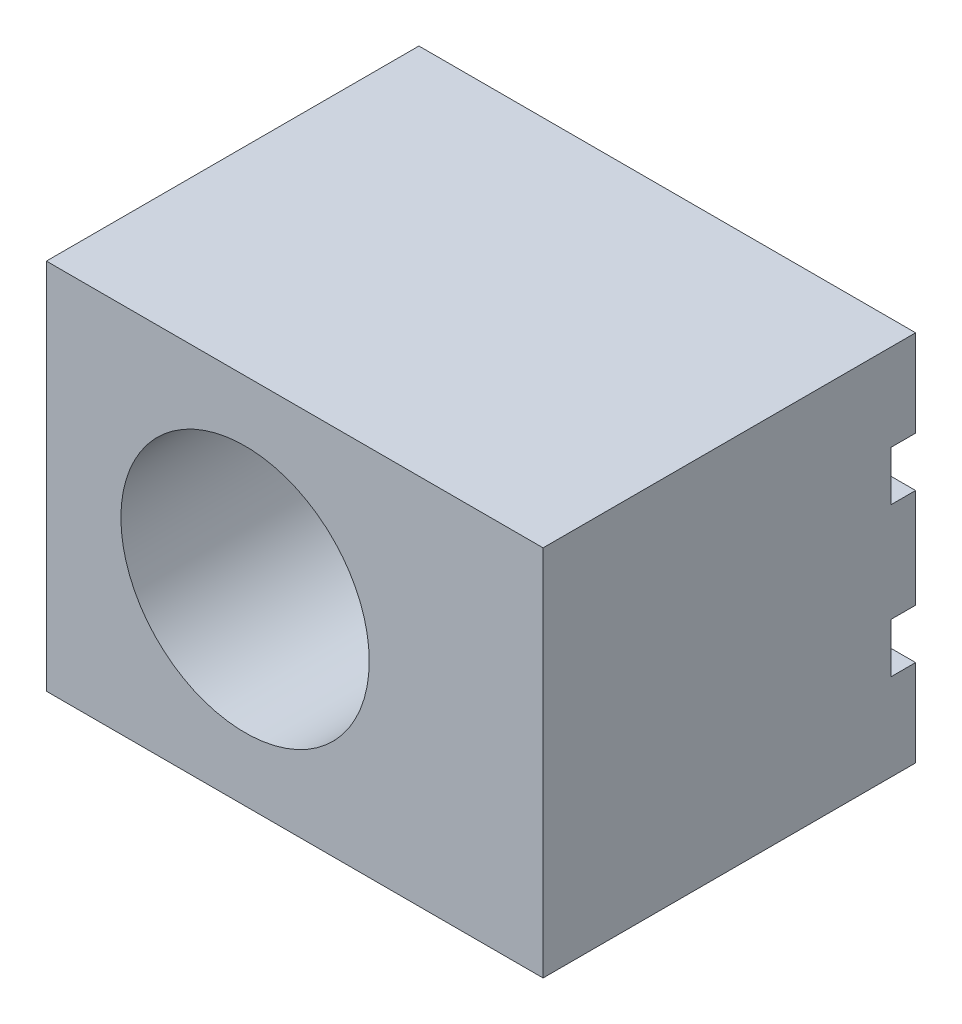
ISO-10303-21;
HEADER;
FILE_DESCRIPTION(('STEP AP214'),'2;1');
FILE_NAME('part.step','',(''),(''),'','','');
FILE_SCHEMA(('AUTOMOTIVE_DESIGN { 1 0 10303 214 1 1 1 1 }'));
ENDSEC;
DATA;
#1=APPLICATION_CONTEXT('core data for automotive mechanical design processes');
#2=APPLICATION_PROTOCOL_DEFINITION('international standard','automotive_design',2000,#1);
#3=PRODUCT_CONTEXT('',#1,'mechanical');
#4=PRODUCT('Part','Part','',(#3));
#5=PRODUCT_RELATED_PRODUCT_CATEGORY('part','',(#4));
#6=PRODUCT_DEFINITION_FORMATION('','',#4);
#7=PRODUCT_DEFINITION_CONTEXT('part definition',#1,'design');
#8=PRODUCT_DEFINITION('design','',#6,#7);
#9=PRODUCT_DEFINITION_SHAPE('','',#8);
#10=(LENGTH_UNIT() NAMED_UNIT(*) SI_UNIT(.MILLI.,.METRE.));
#11=(NAMED_UNIT(*) PLANE_ANGLE_UNIT() SI_UNIT($,.RADIAN.));
#12=(NAMED_UNIT(*) SI_UNIT($,.STERADIAN.) SOLID_ANGLE_UNIT());
#13=UNCERTAINTY_MEASURE_WITH_UNIT(LENGTH_MEASURE(1.E-05),#10,'distance_accuracy_value','');
#14=(GEOMETRIC_REPRESENTATION_CONTEXT(3) GLOBAL_UNCERTAINTY_ASSIGNED_CONTEXT((#13)) GLOBAL_UNIT_ASSIGNED_CONTEXT((#10,
#11,#12)) REPRESENTATION_CONTEXT('',''));
#15=CARTESIAN_POINT('',(0.,0.,0.));
#16=DIRECTION('',(0.,0.,1.));
#17=DIRECTION('',(1.,0.,0.));
#18=AXIS2_PLACEMENT_3D('',#15,#16,#17);
#19=CARTESIAN_POINT('',(0.,0.,0.));
#20=DIRECTION('',(0.,0.,1.));
#21=DIRECTION('',(1.,0.,0.));
#22=AXIS2_PLACEMENT_3D('',#19,#20,#21);
#23=PLANE('',#22);
#24=DIRECTION('',(0.,-1.,0.));
#25=VECTOR('',#24,1.);
#26=CARTESIAN_POINT('',(-4.70744680851064,-3.77659574468085,0.));
#27=LINE('',#26,#25);
#28=CARTESIAN_POINT('',(-4.70744680851064,-2.02659574468085,0.));
#29=VERTEX_POINT('',#28);
#30=CARTESIAN_POINT('',(-4.70744680851064,-3.77659574468085,0.));
#31=VERTEX_POINT('',#30);
#32=EDGE_CURVE('E294',#29,#31,#27,.T.);
#33=ORIENTED_EDGE('',*,*,#32,.F.);
#34=DIRECTION('',(-1.,0.,0.));
#35=VECTOR('',#34,1.);
#36=CARTESIAN_POINT('',(-4.70744680851064,-2.02659574468085,0.));
#37=LINE('',#36,#35);
#38=CARTESIAN_POINT('',(-2.17131486528402,-2.02659574468085,0.));
#39=VERTEX_POINT('',#38);
#40=EDGE_CURVE('E427',#39,#29,#37,.T.);
#41=ORIENTED_EDGE('',*,*,#40,.F.);
#42=CARTESIAN_POINT('',(-0.707446808510637,0.,0.));
#43=DIRECTION('',(0.,0.,1.));
#44=DIRECTION('',(1.,0.,0.));
#45=AXIS2_PLACEMENT_3D('',#42,#43,#44);
#46=CIRCLE('',#45,2.5);
#47=CARTESIAN_POINT('',(0.756421248262748,-2.02659574468085,0.));
#48=VERTEX_POINT('',#47);
#49=EDGE_CURVE('E259',#39,#48,#46,.T.);
#50=ORIENTED_EDGE('',*,*,#49,.T.);
#51=CARTESIAN_POINT('',(5.29255319148936,-2.02659574468085,0.));
#52=VERTEX_POINT('',#51);
#53=EDGE_CURVE('E200',#52,#48,#37,.T.);
#54=ORIENTED_EDGE('',*,*,#53,.F.);
#55=DIRECTION('',(0.,1.,0.));
#56=VECTOR('',#55,1.);
#57=CARTESIAN_POINT('',(5.29255319148936,-3.77659574468085,0.));
#58=LINE('',#57,#56);
#59=CARTESIAN_POINT('',(5.29255319148936,-3.77659574468085,0.));
#60=VERTEX_POINT('',#59);
#61=EDGE_CURVE('E286',#60,#52,#58,.T.);
#62=ORIENTED_EDGE('',*,*,#61,.F.);
#63=DIRECTION('',(1.,0.,0.));
#64=VECTOR('',#63,1.);
#65=CARTESIAN_POINT('',(-4.70744680851064,-3.77659574468085,0.));
#66=LINE('',#65,#64);
#67=EDGE_CURVE('E281',#31,#60,#66,.T.);
#68=ORIENTED_EDGE('',*,*,#67,.F.);
#69=EDGE_LOOP('',(#33,#41,#50,#54,#62,#68));
#70=FACE_BOUND('',#69,.T.);
#71=ADVANCED_FACE('F45',(#70),#23,.F.);
#72=CARTESIAN_POINT('',(5.29255319148936,-1.02659574468085,0.));
#73=VERTEX_POINT('',#72);
#74=CARTESIAN_POINT('',(5.29255319148936,0.973404255319154,0.));
#75=VERTEX_POINT('',#74);
#76=EDGE_CURVE('E291',#73,#75,#58,.T.);
#77=ORIENTED_EDGE('',*,*,#76,.F.);
#78=DIRECTION('',(1.,0.,0.));
#79=VECTOR('',#78,1.);
#80=CARTESIAN_POINT('',(-4.70744680851064,-1.02659574468085,0.));
#81=LINE('',#80,#79);
#82=CARTESIAN_POINT('',(1.57204900789333,-1.02659574468085,0.));
#83=VERTEX_POINT('',#82);
#84=EDGE_CURVE('E240',#83,#73,#81,.T.);
#85=ORIENTED_EDGE('',*,*,#84,.F.);
#86=CARTESIAN_POINT('',(1.5952655390757,0.973404255319154,0.));
#87=VERTEX_POINT('',#86);
#88=EDGE_CURVE('E255',#83,#87,#46,.T.);
#89=ORIENTED_EDGE('',*,*,#88,.T.);
#90=DIRECTION('',(-1.,0.,0.));
#91=VECTOR('',#90,1.);
#92=CARTESIAN_POINT('',(-4.70744680851064,0.973404255319154,0.));
#93=LINE('',#92,#91);
#94=EDGE_CURVE('E232',#75,#87,#93,.T.);
#95=ORIENTED_EDGE('',*,*,#94,.F.);
#96=EDGE_LOOP('',(#77,#85,#89,#95));
#97=FACE_BOUND('',#96,.T.);
#98=ADVANCED_FACE('F402',(#97),#23,.F.);
#99=CARTESIAN_POINT('',(-3.01015915609697,0.973404255319154,0.));
#100=VERTEX_POINT('',#99);
#101=CARTESIAN_POINT('',(-2.9869426249146,-1.02659574468085,0.));
#102=VERTEX_POINT('',#101);
#103=EDGE_CURVE('E361',#100,#102,#46,.T.);
#104=ORIENTED_EDGE('',*,*,#103,.T.);
#105=CARTESIAN_POINT('',(-4.70744680851064,-1.02659574468085,0.));
#106=VERTEX_POINT('',#105);
#107=EDGE_CURVE('E428',#106,#102,#81,.T.);
#108=ORIENTED_EDGE('',*,*,#107,.F.);
#109=CARTESIAN_POINT('',(-4.70744680851064,0.973404255319154,0.));
#110=VERTEX_POINT('',#109);
#111=EDGE_CURVE('E206',#110,#106,#27,.T.);
#112=ORIENTED_EDGE('',*,*,#111,.F.);
#113=EDGE_CURVE('E236',#100,#110,#93,.T.);
#114=ORIENTED_EDGE('',*,*,#113,.F.);
#115=EDGE_LOOP('',(#104,#108,#112,#114));
#116=FACE_BOUND('',#115,.T.);
#117=ADVANCED_FACE('F450',(#116),#23,.F.);
#118=CARTESIAN_POINT('',(-4.70744680851064,-3.77659574468085,7.5));
#119=DIRECTION('',(0.,1.,0.));
#120=DIRECTION('',(0.,0.,1.));
#121=AXIS2_PLACEMENT_3D('',#118,#119,#120);
#122=PLANE('',#121);
#123=ORIENTED_EDGE('',*,*,#67,.T.);
#124=DIRECTION('',(0.,0.,-1.));
#125=VECTOR('',#124,1.);
#126=CARTESIAN_POINT('',(5.29255319148936,-3.77659574468085,7.5));
#127=LINE('',#126,#125);
#128=CARTESIAN_POINT('',(5.29255319148936,-3.77659574468085,7.5));
#129=VERTEX_POINT('',#128);
#130=EDGE_CURVE('E309',#129,#60,#127,.T.);
#131=ORIENTED_EDGE('',*,*,#130,.F.);
#132=DIRECTION('',(1.,0.,0.));
#133=VECTOR('',#132,1.);
#134=CARTESIAN_POINT('',(-4.70744680851064,-3.77659574468085,7.5));
#135=LINE('',#134,#133);
#136=CARTESIAN_POINT('',(-4.70744680851064,-3.77659574468085,7.5));
#137=VERTEX_POINT('',#136);
#138=EDGE_CURVE('E266',#137,#129,#135,.T.);
#139=ORIENTED_EDGE('',*,*,#138,.F.);
#140=DIRECTION('',(0.,0.,-1.));
#141=VECTOR('',#140,1.);
#142=CARTESIAN_POINT('',(-4.70744680851064,-3.77659574468085,7.5));
#143=LINE('',#142,#141);
#144=EDGE_CURVE('E280',#137,#31,#143,.T.);
#145=ORIENTED_EDGE('',*,*,#144,.T.);
#146=EDGE_LOOP('',(#123,#131,#139,#145));
#147=FACE_BOUND('',#146,.T.);
#148=ADVANCED_FACE('F47',(#147),#122,.F.);
#149=CARTESIAN_POINT('',(5.29255319148936,-3.77659574468085,7.5));
#150=DIRECTION('',(-1.,0.,0.));
#151=DIRECTION('',(0.,0.,1.));
#152=AXIS2_PLACEMENT_3D('',#149,#150,#151);
#153=PLANE('',#152);
#154=ORIENTED_EDGE('',*,*,#61,.T.);
#155=DIRECTION('',(0.,0.,-1.));
#156=VECTOR('',#155,1.);
#157=CARTESIAN_POINT('',(5.29255319148936,-2.02659574468085,0.5));
#158=LINE('',#157,#156);
#159=CARTESIAN_POINT('',(5.29255319148936,-2.02659574468085,0.5));
#160=VERTEX_POINT('',#159);
#161=EDGE_CURVE('E213',#160,#52,#158,.T.);
#162=ORIENTED_EDGE('',*,*,#161,.F.);
#163=DIRECTION('',(0.,-1.,0.));
#164=VECTOR('',#163,1.);
#165=CARTESIAN_POINT('',(5.29255319148936,-2.02659574468085,0.5));
#166=LINE('',#165,#164);
#167=CARTESIAN_POINT('',(5.29255319148936,-1.02659574468085,0.5));
#168=VERTEX_POINT('',#167);
#169=EDGE_CURVE('E188',#168,#160,#166,.T.);
#170=ORIENTED_EDGE('',*,*,#169,.F.);
#171=DIRECTION('',(0.,0.,-1.));
#172=VECTOR('',#171,1.);
#173=CARTESIAN_POINT('',(5.29255319148936,-1.02659574468085,0.5));
#174=LINE('',#173,#172);
#175=EDGE_CURVE('E208',#168,#73,#174,.T.);
#176=ORIENTED_EDGE('',*,*,#175,.T.);
#177=ORIENTED_EDGE('',*,*,#76,.T.);
#178=DIRECTION('',(0.,0.,-1.));
#179=VECTOR('',#178,1.);
#180=CARTESIAN_POINT('',(5.29255319148936,0.973404255319154,0.5));
#181=LINE('',#180,#179);
#182=CARTESIAN_POINT('',(5.29255319148936,0.973404255319154,0.5));
#183=VERTEX_POINT('',#182);
#184=EDGE_CURVE('E226',#183,#75,#181,.T.);
#185=ORIENTED_EDGE('',*,*,#184,.F.);
#186=DIRECTION('',(0.,-1.,0.));
#187=VECTOR('',#186,1.);
#188=CARTESIAN_POINT('',(5.29255319148936,0.973404255319154,0.5));
#189=LINE('',#188,#187);
#190=CARTESIAN_POINT('',(5.29255319148936,1.97340425531915,0.5));
#191=VERTEX_POINT('',#190);
#192=EDGE_CURVE('E244',#191,#183,#189,.T.);
#193=ORIENTED_EDGE('',*,*,#192,.F.);
#194=DIRECTION('',(0.,0.,-1.));
#195=VECTOR('',#194,1.);
#196=CARTESIAN_POINT('',(5.29255319148936,1.97340425531915,0.5));
#197=LINE('',#196,#195);
#198=CARTESIAN_POINT('',(5.29255319148936,1.97340425531915,0.));
#199=VERTEX_POINT('',#198);
#200=EDGE_CURVE('E222',#191,#199,#197,.T.);
#201=ORIENTED_EDGE('',*,*,#200,.T.);
#202=CARTESIAN_POINT('',(5.29255319148936,3.72340425531915,0.));
#203=VERTEX_POINT('',#202);
#204=EDGE_CURVE('E285',#199,#203,#58,.T.);
#205=ORIENTED_EDGE('',*,*,#204,.T.);
#206=DIRECTION('',(0.,0.,-1.));
#207=VECTOR('',#206,1.);
#208=CARTESIAN_POINT('',(5.29255319148936,3.72340425531915,7.5));
#209=LINE('',#208,#207);
#210=CARTESIAN_POINT('',(5.29255319148936,3.72340425531915,7.5));
#211=VERTEX_POINT('',#210);
#212=EDGE_CURVE('E305',#211,#203,#209,.T.);
#213=ORIENTED_EDGE('',*,*,#212,.F.);
#214=DIRECTION('',(0.,1.,0.));
#215=VECTOR('',#214,1.);
#216=CARTESIAN_POINT('',(5.29255319148936,-3.77659574468085,7.5));
#217=LINE('',#216,#215);
#218=EDGE_CURVE('E270',#129,#211,#217,.T.);
#219=ORIENTED_EDGE('',*,*,#218,.F.);
#220=ORIENTED_EDGE('',*,*,#130,.T.);
#221=EDGE_LOOP('',(#154,#162,#170,#176,#177,#185,#193,#201,#205,#213,#219,#220));
#222=FACE_BOUND('',#221,.T.);
#223=ADVANCED_FACE('F389',(#222),#153,.F.);
#224=CARTESIAN_POINT('',(-4.70744680851064,3.72340425531915,7.5));
#225=DIRECTION('',(0.,-1.,0.));
#226=DIRECTION('',(0.,0.,-1.));
#227=AXIS2_PLACEMENT_3D('',#224,#225,#226);
#228=PLANE('',#227);
#229=DIRECTION('',(-1.,0.,0.));
#230=VECTOR('',#229,1.);
#231=CARTESIAN_POINT('',(-4.70744680851064,3.72340425531915,0.));
#232=LINE('',#231,#230);
#233=CARTESIAN_POINT('',(-4.70744680851064,3.72340425531915,0.));
#234=VERTEX_POINT('',#233);
#235=EDGE_CURVE('E290',#203,#234,#232,.T.);
#236=ORIENTED_EDGE('',*,*,#235,.T.);
#237=DIRECTION('',(0.,0.,-1.));
#238=VECTOR('',#237,1.);
#239=CARTESIAN_POINT('',(-4.70744680851064,3.72340425531915,7.5));
#240=LINE('',#239,#238);
#241=CARTESIAN_POINT('',(-4.70744680851064,3.72340425531915,7.5));
#242=VERTEX_POINT('',#241);
#243=EDGE_CURVE('E301',#242,#234,#240,.T.);
#244=ORIENTED_EDGE('',*,*,#243,.F.);
#245=DIRECTION('',(-1.,0.,0.));
#246=VECTOR('',#245,1.);
#247=CARTESIAN_POINT('',(-4.70744680851064,3.72340425531915,7.5));
#248=LINE('',#247,#246);
#249=EDGE_CURVE('E274',#211,#242,#248,.T.);
#250=ORIENTED_EDGE('',*,*,#249,.F.);
#251=ORIENTED_EDGE('',*,*,#212,.T.);
#252=EDGE_LOOP('',(#236,#244,#250,#251));
#253=FACE_BOUND('',#252,.T.);
#254=ADVANCED_FACE('F385',(#253),#228,.F.);
#255=CARTESIAN_POINT('',(-4.70744680851064,-3.77659574468085,7.5));
#256=DIRECTION('',(1.,0.,0.));
#257=DIRECTION('',(0.,0.,-1.));
#258=AXIS2_PLACEMENT_3D('',#255,#256,#257);
#259=PLANE('',#258);
#260=DIRECTION('',(0.,1.,0.));
#261=VECTOR('',#260,1.);
#262=CARTESIAN_POINT('',(-4.70744680851064,-2.02659574468085,0.5));
#263=LINE('',#262,#261);
#264=CARTESIAN_POINT('',(-4.70744680851064,-2.02659574468085,0.5));
#265=VERTEX_POINT('',#264);
#266=CARTESIAN_POINT('',(-4.70744680851064,-1.02659574468085,0.5));
#267=VERTEX_POINT('',#266);
#268=EDGE_CURVE('E192',#265,#267,#263,.T.);
#269=ORIENTED_EDGE('',*,*,#268,.F.);
#270=DIRECTION('',(0.,0.,-1.));
#271=VECTOR('',#270,1.);
#272=CARTESIAN_POINT('',(-4.70744680851064,-2.02659574468085,0.5));
#273=LINE('',#272,#271);
#274=EDGE_CURVE('E265',#265,#29,#273,.T.);
#275=ORIENTED_EDGE('',*,*,#274,.T.);
#276=ORIENTED_EDGE('',*,*,#32,.T.);
#277=ORIENTED_EDGE('',*,*,#144,.F.);
#278=DIRECTION('',(0.,-1.,0.));
#279=VECTOR('',#278,1.);
#280=CARTESIAN_POINT('',(-4.70744680851064,-3.77659574468085,7.5));
#281=LINE('',#280,#279);
#282=EDGE_CURVE('E277',#242,#137,#281,.T.);
#283=ORIENTED_EDGE('',*,*,#282,.F.);
#284=ORIENTED_EDGE('',*,*,#243,.T.);
#285=CARTESIAN_POINT('',(-4.70744680851064,1.97340425531915,0.));
#286=VERTEX_POINT('',#285);
#287=EDGE_CURVE('E271',#234,#286,#27,.T.);
#288=ORIENTED_EDGE('',*,*,#287,.T.);
#289=DIRECTION('',(0.,0.,-1.));
#290=VECTOR('',#289,1.);
#291=CARTESIAN_POINT('',(-4.70744680851064,1.97340425531915,0.5));
#292=LINE('',#291,#290);
#293=CARTESIAN_POINT('',(-4.70744680851064,1.97340425531915,0.5));
#294=VERTEX_POINT('',#293);
#295=EDGE_CURVE('E218',#294,#286,#292,.T.);
#296=ORIENTED_EDGE('',*,*,#295,.F.);
#297=DIRECTION('',(0.,1.,0.));
#298=VECTOR('',#297,1.);
#299=CARTESIAN_POINT('',(-4.70744680851064,0.973404255319154,0.5));
#300=LINE('',#299,#298);
#301=CARTESIAN_POINT('',(-4.70744680851064,0.973404255319154,0.5));
#302=VERTEX_POINT('',#301);
#303=EDGE_CURVE('E251',#302,#294,#300,.T.);
#304=ORIENTED_EDGE('',*,*,#303,.F.);
#305=DIRECTION('',(0.,0.,-1.));
#306=VECTOR('',#305,1.);
#307=CARTESIAN_POINT('',(-4.70744680851064,0.973404255319154,0.5));
#308=LINE('',#307,#306);
#309=EDGE_CURVE('E229',#302,#110,#308,.T.);
#310=ORIENTED_EDGE('',*,*,#309,.T.);
#311=ORIENTED_EDGE('',*,*,#111,.T.);
#312=DIRECTION('',(0.,0.,-1.));
#313=VECTOR('',#312,1.);
#314=CARTESIAN_POINT('',(-4.70744680851064,-1.02659574468085,0.5));
#315=LINE('',#314,#313);
#316=EDGE_CURVE('E183',#267,#106,#315,.T.);
#317=ORIENTED_EDGE('',*,*,#316,.F.);
#318=EDGE_LOOP('',(#269,#275,#276,#277,#283,#284,#288,#296,#304,#310,#311,#317));
#319=FACE_BOUND('',#318,.T.);
#320=ADVANCED_FACE('F203',(#319),#259,.F.);
#321=CARTESIAN_POINT('',(0.,0.,7.5));
#322=DIRECTION('',(0.,0.,1.));
#323=DIRECTION('',(1.,0.,0.));
#324=AXIS2_PLACEMENT_3D('',#321,#322,#323);
#325=PLANE('',#324);
#326=CARTESIAN_POINT('',(-0.707446808510637,0.,7.5));
#327=DIRECTION('',(0.,0.,1.));
#328=DIRECTION('',(1.,0.,0.));
#329=AXIS2_PLACEMENT_3D('',#326,#327,#328);
#330=CIRCLE('',#329,2.5);
#331=CARTESIAN_POINT('',(1.79255319148936,0.,7.5));
#332=VERTEX_POINT('',#331);
#333=EDGE_CURVE('E260',#332,#332,#330,.T.);
#334=ORIENTED_EDGE('',*,*,#333,.F.);
#335=EDGE_LOOP('',(#334));
#336=FACE_BOUND('',#335,.T.);
#337=ORIENTED_EDGE('',*,*,#138,.T.);
#338=ORIENTED_EDGE('',*,*,#218,.T.);
#339=ORIENTED_EDGE('',*,*,#249,.T.);
#340=ORIENTED_EDGE('',*,*,#282,.T.);
#341=EDGE_LOOP('',(#337,#338,#339,#340));
#342=FACE_BOUND('',#341,.T.);
#343=ADVANCED_FACE('F461',(#336,#342),#325,.T.);
#344=ORIENTED_EDGE('',*,*,#204,.F.);
#345=DIRECTION('',(1.,0.,0.));
#346=VECTOR('',#345,1.);
#347=CARTESIAN_POINT('',(-4.70744680851064,1.97340425531915,0.));
#348=LINE('',#347,#346);
#349=CARTESIAN_POINT('',(0.827374238089994,1.97340425531915,0.));
#350=VERTEX_POINT('',#349);
#351=EDGE_CURVE('E235',#350,#199,#348,.T.);
#352=ORIENTED_EDGE('',*,*,#351,.F.);
#353=CARTESIAN_POINT('',(-2.24226785511127,1.97340425531915,0.));
#354=VERTEX_POINT('',#353);
#355=EDGE_CURVE('E261',#350,#354,#46,.T.);
#356=ORIENTED_EDGE('',*,*,#355,.T.);
#357=EDGE_CURVE('E237',#286,#354,#348,.T.);
#358=ORIENTED_EDGE('',*,*,#357,.F.);
#359=ORIENTED_EDGE('',*,*,#287,.F.);
#360=ORIENTED_EDGE('',*,*,#235,.F.);
#361=EDGE_LOOP('',(#344,#352,#356,#358,#359,#360));
#362=FACE_BOUND('',#361,.T.);
#363=ADVANCED_FACE('F372',(#362),#23,.F.);
#364=CARTESIAN_POINT('',(-0.707446808510637,0.,0.));
#365=DIRECTION('',(0.,0.,1.));
#366=DIRECTION('',(1.,0.,0.));
#367=AXIS2_PLACEMENT_3D('',#364,#365,#366);
#368=CYLINDRICAL_SURFACE('',#367,2.5);
#369=ORIENTED_EDGE('',*,*,#49,.F.);
#370=DIRECTION('',(0.,0.,1.));
#371=VECTOR('',#370,1.);
#372=CARTESIAN_POINT('',(-2.17131486528402,-2.02659574468085,0.));
#373=LINE('',#372,#371);
#374=CARTESIAN_POINT('',(-2.17131486528402,-2.02659574468085,0.5));
#375=VERTEX_POINT('',#374);
#376=EDGE_CURVE('E11',#39,#375,#373,.T.);
#377=ORIENTED_EDGE('',*,*,#376,.T.);
#378=CARTESIAN_POINT('',(-0.707446808510637,0.,0.5));
#379=DIRECTION('',(0.,0.,-1.));
#380=DIRECTION('',(-1.,0.,0.));
#381=AXIS2_PLACEMENT_3D('',#378,#379,#380);
#382=CIRCLE('',#381,2.5);
#383=CARTESIAN_POINT('',(-2.9869426249146,-1.02659574468085,0.5));
#384=VERTEX_POINT('',#383);
#385=EDGE_CURVE('E337',#384,#375,#382,.F.);
#386=ORIENTED_EDGE('',*,*,#385,.F.);
#387=DIRECTION('',(0.,0.,1.));
#388=VECTOR('',#387,1.);
#389=CARTESIAN_POINT('',(-2.9869426249146,-1.02659574468085,0.));
#390=LINE('',#389,#388);
#391=EDGE_CURVE('E54',#384,#102,#390,.F.);
#392=ORIENTED_EDGE('',*,*,#391,.T.);
#393=ORIENTED_EDGE('',*,*,#103,.F.);
#394=DIRECTION('',(0.,0.,1.));
#395=VECTOR('',#394,1.);
#396=CARTESIAN_POINT('',(-3.01015915609697,0.973404255319154,0.));
#397=LINE('',#396,#395);
#398=CARTESIAN_POINT('',(-3.01015915609697,0.973404255319154,0.5));
#399=VERTEX_POINT('',#398);
#400=EDGE_CURVE('E321',#100,#399,#397,.T.);
#401=ORIENTED_EDGE('',*,*,#400,.T.);
#402=CARTESIAN_POINT('',(-0.707446808510637,0.,0.5));
#403=DIRECTION('',(0.,0.,-1.));
#404=DIRECTION('',(-1.,0.,0.));
#405=AXIS2_PLACEMENT_3D('',#402,#403,#404);
#406=CIRCLE('',#405,2.5);
#407=CARTESIAN_POINT('',(-2.24226785511127,1.97340425531915,0.5));
#408=VERTEX_POINT('',#407);
#409=EDGE_CURVE('E313',#408,#399,#406,.F.);
#410=ORIENTED_EDGE('',*,*,#409,.F.);
#411=DIRECTION('',(0.,0.,1.));
#412=VECTOR('',#411,1.);
#413=CARTESIAN_POINT('',(-2.24226785511127,1.97340425531915,0.));
#414=LINE('',#413,#412);
#415=EDGE_CURVE('E316',#408,#354,#414,.F.);
#416=ORIENTED_EDGE('',*,*,#415,.T.);
#417=ORIENTED_EDGE('',*,*,#355,.F.);
#418=DIRECTION('',(0.,0.,1.));
#419=VECTOR('',#418,1.);
#420=CARTESIAN_POINT('',(0.827374238089994,1.97340425531915,0.));
#421=LINE('',#420,#419);
#422=CARTESIAN_POINT('',(0.827374238089994,1.97340425531915,0.5));
#423=VERTEX_POINT('',#422);
#424=EDGE_CURVE('E325',#350,#423,#421,.T.);
#425=ORIENTED_EDGE('',*,*,#424,.T.);
#426=CARTESIAN_POINT('',(1.5952655390757,0.973404255319154,0.5));
#427=VERTEX_POINT('',#426);
#428=EDGE_CURVE('E317',#427,#423,#406,.F.);
#429=ORIENTED_EDGE('',*,*,#428,.F.);
#430=DIRECTION('',(0.,0.,1.));
#431=VECTOR('',#430,1.);
#432=CARTESIAN_POINT('',(1.5952655390757,0.973404255319154,0.));
#433=LINE('',#432,#431);
#434=EDGE_CURVE('E329',#427,#87,#433,.F.);
#435=ORIENTED_EDGE('',*,*,#434,.T.);
#436=ORIENTED_EDGE('',*,*,#88,.F.);
#437=DIRECTION('',(0.,0.,1.));
#438=VECTOR('',#437,1.);
#439=CARTESIAN_POINT('',(1.57204900789333,-1.02659574468085,0.));
#440=LINE('',#439,#438);
#441=CARTESIAN_POINT('',(1.57204900789333,-1.02659574468085,0.5));
#442=VERTEX_POINT('',#441);
#443=EDGE_CURVE('E336',#83,#442,#440,.T.);
#444=ORIENTED_EDGE('',*,*,#443,.T.);
#445=CARTESIAN_POINT('',(0.756421248262748,-2.02659574468085,0.5));
#446=VERTEX_POINT('',#445);
#447=EDGE_CURVE('E333',#446,#442,#382,.F.);
#448=ORIENTED_EDGE('',*,*,#447,.F.);
#449=DIRECTION('',(0.,0.,1.));
#450=VECTOR('',#449,1.);
#451=CARTESIAN_POINT('',(0.756421248262748,-2.02659574468085,0.));
#452=LINE('',#451,#450);
#453=EDGE_CURVE('E341',#446,#48,#452,.F.);
#454=ORIENTED_EDGE('',*,*,#453,.T.);
#455=EDGE_LOOP('',(#369,#377,#386,#392,#393,#401,#410,#416,#417,#425,#429,#435,#436,#444,#448,#454));
#456=FACE_BOUND('',#455,.T.);
#457=ORIENTED_EDGE('',*,*,#333,.T.);
#458=EDGE_LOOP('',(#457));
#459=FACE_BOUND('',#458,.T.);
#460=ADVANCED_FACE('F354',(#456,#459),#368,.F.);
#461=CARTESIAN_POINT('',(0.,0.,0.5));
#462=DIRECTION('',(0.,0.,-1.));
#463=DIRECTION('',(-1.,0.,0.));
#464=AXIS2_PLACEMENT_3D('',#461,#462,#463);
#465=PLANE('',#464);
#466=ORIENTED_EDGE('',*,*,#409,.T.);
#467=DIRECTION('',(-1.,0.,0.));
#468=VECTOR('',#467,1.);
#469=CARTESIAN_POINT('',(-4.70744680851064,0.973404255319154,0.5));
#470=LINE('',#469,#468);
#471=EDGE_CURVE('E221',#399,#302,#470,.T.);
#472=ORIENTED_EDGE('',*,*,#471,.T.);
#473=ORIENTED_EDGE('',*,*,#303,.T.);
#474=DIRECTION('',(1.,0.,0.));
#475=VECTOR('',#474,1.);
#476=CARTESIAN_POINT('',(-4.70744680851064,1.97340425531915,0.5));
#477=LINE('',#476,#475);
#478=EDGE_CURVE('E248',#294,#408,#477,.T.);
#479=ORIENTED_EDGE('',*,*,#478,.T.);
#480=EDGE_LOOP('',(#466,#472,#473,#479));
#481=FACE_BOUND('',#480,.T.);
#482=ADVANCED_FACE('F447',(#481),#465,.T.);
#483=CARTESIAN_POINT('',(-4.70744680851064,1.97340425531915,0.5));
#484=DIRECTION('',(0.,1.,0.));
#485=DIRECTION('',(0.,0.,1.));
#486=AXIS2_PLACEMENT_3D('',#483,#484,#485);
#487=PLANE('',#486);
#488=ORIENTED_EDGE('',*,*,#478,.F.);
#489=ORIENTED_EDGE('',*,*,#295,.T.);
#490=ORIENTED_EDGE('',*,*,#357,.T.);
#491=ORIENTED_EDGE('',*,*,#415,.F.);
#492=EDGE_LOOP('',(#488,#489,#490,#491));
#493=FACE_BOUND('',#492,.T.);
#494=ADVANCED_FACE('F378',(#493),#487,.F.);
#495=CARTESIAN_POINT('',(-4.70744680851064,0.973404255319154,0.5));
#496=DIRECTION('',(0.,-1.,0.));
#497=DIRECTION('',(0.,0.,-1.));
#498=AXIS2_PLACEMENT_3D('',#495,#496,#497);
#499=PLANE('',#498);
#500=ORIENTED_EDGE('',*,*,#113,.T.);
#501=ORIENTED_EDGE('',*,*,#309,.F.);
#502=ORIENTED_EDGE('',*,*,#471,.F.);
#503=ORIENTED_EDGE('',*,*,#400,.F.);
#504=EDGE_LOOP('',(#500,#501,#502,#503));
#505=FACE_BOUND('',#504,.T.);
#506=ADVANCED_FACE('F449',(#505),#499,.F.);
#507=EDGE_CURVE('E241',#183,#427,#470,.T.);
#508=ORIENTED_EDGE('',*,*,#507,.F.);
#509=ORIENTED_EDGE('',*,*,#184,.T.);
#510=ORIENTED_EDGE('',*,*,#94,.T.);
#511=ORIENTED_EDGE('',*,*,#434,.F.);
#512=EDGE_LOOP('',(#508,#509,#510,#511));
#513=FACE_BOUND('',#512,.T.);
#514=ADVANCED_FACE('F407',(#513),#499,.F.);
#515=ORIENTED_EDGE('',*,*,#351,.T.);
#516=ORIENTED_EDGE('',*,*,#200,.F.);
#517=EDGE_CURVE('E247',#423,#191,#477,.T.);
#518=ORIENTED_EDGE('',*,*,#517,.F.);
#519=ORIENTED_EDGE('',*,*,#424,.F.);
#520=EDGE_LOOP('',(#515,#516,#518,#519));
#521=FACE_BOUND('',#520,.T.);
#522=ADVANCED_FACE('F500',(#521),#487,.F.);
#523=ORIENTED_EDGE('',*,*,#428,.T.);
#524=ORIENTED_EDGE('',*,*,#517,.T.);
#525=ORIENTED_EDGE('',*,*,#192,.T.);
#526=ORIENTED_EDGE('',*,*,#507,.T.);
#527=EDGE_LOOP('',(#523,#524,#525,#526));
#528=FACE_BOUND('',#527,.T.);
#529=ADVANCED_FACE('F490',(#528),#465,.T.);
#530=CARTESIAN_POINT('',(0.,0.,0.5));
#531=DIRECTION('',(0.,0.,-1.));
#532=DIRECTION('',(-1.,0.,0.));
#533=AXIS2_PLACEMENT_3D('',#530,#531,#532);
#534=PLANE('',#533);
#535=ORIENTED_EDGE('',*,*,#447,.T.);
#536=DIRECTION('',(1.,0.,0.));
#537=VECTOR('',#536,1.);
#538=CARTESIAN_POINT('',(-4.70744680851064,-1.02659574468085,0.5));
#539=LINE('',#538,#537);
#540=EDGE_CURVE('E189',#442,#168,#539,.T.);
#541=ORIENTED_EDGE('',*,*,#540,.T.);
#542=ORIENTED_EDGE('',*,*,#169,.T.);
#543=DIRECTION('',(-1.,0.,0.));
#544=VECTOR('',#543,1.);
#545=CARTESIAN_POINT('',(-4.70744680851064,-2.02659574468085,0.5));
#546=LINE('',#545,#544);
#547=EDGE_CURVE('E69',#160,#446,#546,.T.);
#548=ORIENTED_EDGE('',*,*,#547,.T.);
#549=EDGE_LOOP('',(#535,#541,#542,#548));
#550=FACE_BOUND('',#549,.T.);
#551=ADVANCED_FACE('F432',(#550),#534,.T.);
#552=CARTESIAN_POINT('',(-4.70744680851064,-1.02659574468085,0.5));
#553=DIRECTION('',(0.,1.,0.));
#554=DIRECTION('',(0.,0.,1.));
#555=AXIS2_PLACEMENT_3D('',#552,#553,#554);
#556=PLANE('',#555);
#557=ORIENTED_EDGE('',*,*,#84,.T.);
#558=ORIENTED_EDGE('',*,*,#175,.F.);
#559=ORIENTED_EDGE('',*,*,#540,.F.);
#560=ORIENTED_EDGE('',*,*,#443,.F.);
#561=EDGE_LOOP('',(#557,#558,#559,#560));
#562=FACE_BOUND('',#561,.T.);
#563=ADVANCED_FACE('F436',(#562),#556,.F.);
#564=CARTESIAN_POINT('',(-4.70744680851064,-2.02659574468085,0.5));
#565=DIRECTION('',(0.,-1.,0.));
#566=DIRECTION('',(1.,0.,0.));
#567=AXIS2_PLACEMENT_3D('',#564,#565,#566);
#568=PLANE('',#567);
#569=ORIENTED_EDGE('',*,*,#547,.F.);
#570=ORIENTED_EDGE('',*,*,#161,.T.);
#571=ORIENTED_EDGE('',*,*,#53,.T.);
#572=ORIENTED_EDGE('',*,*,#453,.F.);
#573=EDGE_LOOP('',(#569,#570,#571,#572));
#574=FACE_BOUND('',#573,.T.);
#575=ADVANCED_FACE('F434',(#574),#568,.F.);
#576=ORIENTED_EDGE('',*,*,#40,.T.);
#577=ORIENTED_EDGE('',*,*,#274,.F.);
#578=EDGE_CURVE('E195',#375,#265,#546,.T.);
#579=ORIENTED_EDGE('',*,*,#578,.F.);
#580=ORIENTED_EDGE('',*,*,#376,.F.);
#581=EDGE_LOOP('',(#576,#577,#579,#580));
#582=FACE_BOUND('',#581,.T.);
#583=ADVANCED_FACE('F350',(#582),#568,.F.);
#584=EDGE_CURVE('E61',#267,#384,#539,.T.);
#585=ORIENTED_EDGE('',*,*,#584,.F.);
#586=ORIENTED_EDGE('',*,*,#316,.T.);
#587=ORIENTED_EDGE('',*,*,#107,.T.);
#588=ORIENTED_EDGE('',*,*,#391,.F.);
#589=EDGE_LOOP('',(#585,#586,#587,#588));
#590=FACE_BOUND('',#589,.T.);
#591=ADVANCED_FACE('F181',(#590),#556,.F.);
#592=ORIENTED_EDGE('',*,*,#385,.T.);
#593=ORIENTED_EDGE('',*,*,#578,.T.);
#594=ORIENTED_EDGE('',*,*,#268,.T.);
#595=ORIENTED_EDGE('',*,*,#584,.T.);
#596=EDGE_LOOP('',(#592,#593,#594,#595));
#597=FACE_BOUND('',#596,.T.);
#598=ADVANCED_FACE('F193',(#597),#534,.T.);
#599=CLOSED_SHELL('',(#71,#98,#117,#148,#223,#254,#320,#343,#363,#460,#482,#494,#506,#514,#522,
#529,#551,#563,#575,#583,#591,#598));
#600=MANIFOLD_SOLID_BREP('B2',#599);
#601=ADVANCED_BREP_SHAPE_REPRESENTATION('',(#18,#600),#14);
#602=SHAPE_DEFINITION_REPRESENTATION(#9,#601);
ENDSEC;
END-ISO-10303-21;
